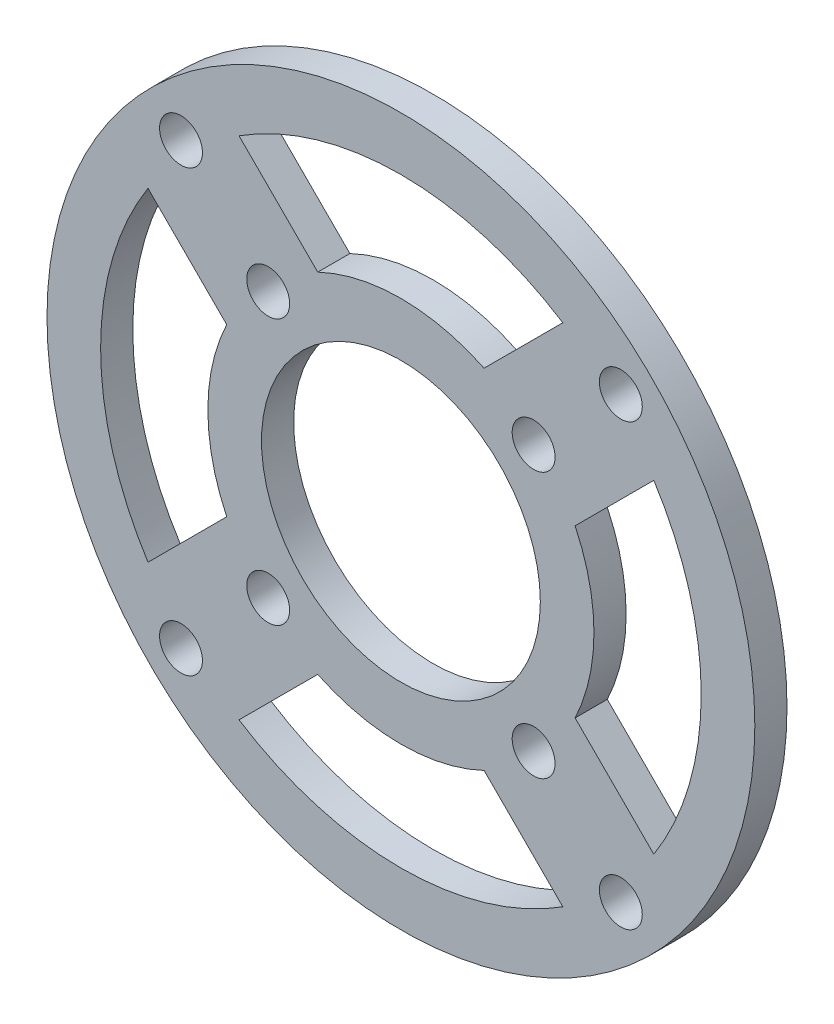
ISO-10303-21;
HEADER;
FILE_DESCRIPTION(('STEP AP214'),'2;1');
FILE_NAME('part.step','',(''),(''),'','','');
FILE_SCHEMA(('AUTOMOTIVE_DESIGN { 1 0 10303 214 1 1 1 1 }'));
ENDSEC;
DATA;
#1=APPLICATION_CONTEXT('core data for automotive mechanical design processes');
#2=APPLICATION_PROTOCOL_DEFINITION('international standard','automotive_design',2000,#1);
#3=PRODUCT_CONTEXT('',#1,'mechanical');
#4=PRODUCT('Part','Part','',(#3));
#5=PRODUCT_RELATED_PRODUCT_CATEGORY('part','',(#4));
#6=PRODUCT_DEFINITION_FORMATION('','',#4);
#7=PRODUCT_DEFINITION_CONTEXT('part definition',#1,'design');
#8=PRODUCT_DEFINITION('design','',#6,#7);
#9=PRODUCT_DEFINITION_SHAPE('','',#8);
#10=(LENGTH_UNIT() NAMED_UNIT(*) SI_UNIT(.MILLI.,.METRE.));
#11=(NAMED_UNIT(*) PLANE_ANGLE_UNIT() SI_UNIT($,.RADIAN.));
#12=(NAMED_UNIT(*) SI_UNIT($,.STERADIAN.) SOLID_ANGLE_UNIT());
#13=UNCERTAINTY_MEASURE_WITH_UNIT(LENGTH_MEASURE(1.E-05),#10,'distance_accuracy_value','');
#14=(GEOMETRIC_REPRESENTATION_CONTEXT(3) GLOBAL_UNCERTAINTY_ASSIGNED_CONTEXT((#13)) GLOBAL_UNIT_ASSIGNED_CONTEXT((#10,
#11,#12)) REPRESENTATION_CONTEXT('',''));
#15=CARTESIAN_POINT('',(0.,0.,0.));
#16=DIRECTION('',(0.,0.,1.));
#17=DIRECTION('',(1.,0.,0.));
#18=AXIS2_PLACEMENT_3D('',#15,#16,#17);
#19=CARTESIAN_POINT('',(0.,0.,3.));
#20=DIRECTION('',(0.,0.,1.));
#21=DIRECTION('',(1.,0.,0.));
#22=AXIS2_PLACEMENT_3D('',#19,#20,#21);
#23=PLANE('',#22);
#24=CARTESIAN_POINT('',(0.,0.,3.));
#25=DIRECTION('',(0.,0.,-1.));
#26=DIRECTION('',(1.,0.,0.));
#27=AXIS2_PLACEMENT_3D('',#24,#25,#26);
#28=CIRCLE('',#27,18.);
#29=CARTESIAN_POINT('',(-7.75735931288063,16.2426406871193,3.));
#30=VERTEX_POINT('',#29);
#31=CARTESIAN_POINT('',(7.75735931288063,16.2426406871193,3.));
#32=VERTEX_POINT('',#31);
#33=EDGE_CURVE('E48',#30,#32,#28,.T.);
#34=ORIENTED_EDGE('',*,*,#33,.F.);
#35=DIRECTION('',(0.707106781186544,-0.707106781186551,0.));
#36=VECTOR('',#35,1.);
#37=CARTESIAN_POINT('',(-7.75735931288063,16.2426406871193,3.));
#38=LINE('',#37,#36);
#39=CARTESIAN_POINT('',(-15.0964389186943,23.5817202929331,3.));
#40=VERTEX_POINT('',#39);
#41=EDGE_CURVE('E167',#40,#30,#38,.T.);
#42=ORIENTED_EDGE('',*,*,#41,.F.);
#43=CARTESIAN_POINT('',(0.,0.,3.));
#44=DIRECTION('',(0.,0.,1.));
#45=DIRECTION('',(1.,0.,0.));
#46=AXIS2_PLACEMENT_3D('',#43,#44,#45);
#47=CIRCLE('',#46,28.);
#48=CARTESIAN_POINT('',(15.0964389186944,23.581720292933,3.));
#49=VERTEX_POINT('',#48);
#50=EDGE_CURVE('E170',#49,#40,#47,.T.);
#51=ORIENTED_EDGE('',*,*,#50,.F.);
#52=DIRECTION('',(0.707106781186551,0.707106781186544,0.));
#53=VECTOR('',#52,1.);
#54=CARTESIAN_POINT('',(7.75735931288063,16.2426406871193,3.));
#55=LINE('',#54,#53);
#56=EDGE_CURVE('E176',#32,#49,#55,.T.);
#57=ORIENTED_EDGE('',*,*,#56,.F.);
#58=EDGE_LOOP('',(#34,#42,#51,#57));
#59=FACE_BOUND('',#58,.T.);
#60=CARTESIAN_POINT('',(0.,0.,3.));
#61=DIRECTION('',(0.,0.,-1.));
#62=DIRECTION('',(1.,0.,0.));
#63=AXIS2_PLACEMENT_3D('',#60,#61,#62);
#64=CIRCLE('',#63,18.);
#65=CARTESIAN_POINT('',(16.2426406871194,7.75735931288057,3.));
#66=VERTEX_POINT('',#65);
#67=CARTESIAN_POINT('',(16.2426406871193,-7.75735931288069,3.));
#68=VERTEX_POINT('',#67);
#69=EDGE_CURVE('E56',#66,#68,#64,.T.);
#70=ORIENTED_EDGE('',*,*,#69,.F.);
#71=DIRECTION('',(-0.707106781186554,-0.707106781186541,0.));
#72=VECTOR('',#71,1.);
#73=CARTESIAN_POINT('',(16.2426406871194,7.75735931288057,3.));
#74=LINE('',#73,#72);
#75=CARTESIAN_POINT('',(23.5817202929331,15.0964389186942,3.));
#76=VERTEX_POINT('',#75);
#77=EDGE_CURVE('E191',#76,#66,#74,.T.);
#78=ORIENTED_EDGE('',*,*,#77,.F.);
#79=CARTESIAN_POINT('',(0.,0.,3.));
#80=DIRECTION('',(0.,0.,1.));
#81=DIRECTION('',(1.,0.,0.));
#82=AXIS2_PLACEMENT_3D('',#79,#80,#81);
#83=CIRCLE('',#82,28.);
#84=CARTESIAN_POINT('',(23.581720292933,-15.0964389186945,3.));
#85=VERTEX_POINT('',#84);
#86=EDGE_CURVE('E206',#85,#76,#83,.T.);
#87=ORIENTED_EDGE('',*,*,#86,.F.);
#88=DIRECTION('',(0.707106781186542,-0.707106781186553,0.));
#89=VECTOR('',#88,1.);
#90=CARTESIAN_POINT('',(16.2426406871193,-7.75735931288069,3.));
#91=LINE('',#90,#89);
#92=EDGE_CURVE('E202',#68,#85,#91,.T.);
#93=ORIENTED_EDGE('',*,*,#92,.F.);
#94=EDGE_LOOP('',(#70,#78,#87,#93));
#95=FACE_BOUND('',#94,.T.);
#96=CARTESIAN_POINT('',(0.,0.,3.));
#97=DIRECTION('',(0.,0.,-1.));
#98=DIRECTION('',(1.,0.,0.));
#99=AXIS2_PLACEMENT_3D('',#96,#97,#98);
#100=CIRCLE('',#99,18.);
#101=CARTESIAN_POINT('',(7.75735931288052,-16.2426406871194,3.));
#102=VERTEX_POINT('',#101);
#103=CARTESIAN_POINT('',(-7.75735931288074,-16.2426406871193,3.));
#104=VERTEX_POINT('',#103);
#105=EDGE_CURVE('E231',#102,#104,#100,.T.);
#106=ORIENTED_EDGE('',*,*,#105,.F.);
#107=DIRECTION('',(-0.707106781186539,0.707106781186556,0.));
#108=VECTOR('',#107,1.);
#109=CARTESIAN_POINT('',(7.75735931288052,-16.2426406871194,3.));
#110=LINE('',#109,#108);
#111=CARTESIAN_POINT('',(15.0964389186941,-23.5817202929332,3.));
#112=VERTEX_POINT('',#111);
#113=EDGE_CURVE('E221',#112,#102,#110,.T.);
#114=ORIENTED_EDGE('',*,*,#113,.F.);
#115=CARTESIAN_POINT('',(0.,0.,3.));
#116=DIRECTION('',(0.,0.,1.));
#117=DIRECTION('',(1.,0.,0.));
#118=AXIS2_PLACEMENT_3D('',#115,#116,#117);
#119=CIRCLE('',#118,28.);
#120=CARTESIAN_POINT('',(-15.0964389186946,-23.5817202929329,3.));
#121=VERTEX_POINT('',#120);
#122=EDGE_CURVE('E237',#121,#112,#119,.T.);
#123=ORIENTED_EDGE('',*,*,#122,.F.);
#124=DIRECTION('',(-0.707106781186556,-0.707106781186539,0.));
#125=VECTOR('',#124,1.);
#126=CARTESIAN_POINT('',(-7.75735931288074,-16.2426406871193,3.));
#127=LINE('',#126,#125);
#128=EDGE_CURVE('E233',#104,#121,#127,.T.);
#129=ORIENTED_EDGE('',*,*,#128,.F.);
#130=EDGE_LOOP('',(#106,#114,#123,#129));
#131=FACE_BOUND('',#130,.T.);
#132=CARTESIAN_POINT('',(0.,0.,3.));
#133=DIRECTION('',(0.,0.,-1.));
#134=DIRECTION('',(1.,0.,0.));
#135=AXIS2_PLACEMENT_3D('',#132,#133,#134);
#136=CIRCLE('',#135,18.);
#137=CARTESIAN_POINT('',(-16.2426406871194,-7.75735931288046,3.));
#138=VERTEX_POINT('',#137);
#139=CARTESIAN_POINT('',(-16.2426406871192,7.7573593128808,3.));
#140=VERTEX_POINT('',#139);
#141=EDGE_CURVE('E263',#138,#140,#136,.T.);
#142=ORIENTED_EDGE('',*,*,#141,.F.);
#143=DIRECTION('',(0.707106781186559,0.707106781186536,0.));
#144=VECTOR('',#143,1.);
#145=CARTESIAN_POINT('',(-16.2426406871194,-7.75735931288046,3.));
#146=LINE('',#145,#144);
#147=CARTESIAN_POINT('',(-23.5817202929332,-15.0964389186941,3.));
#148=VERTEX_POINT('',#147);
#149=EDGE_CURVE('E253',#148,#138,#146,.T.);
#150=ORIENTED_EDGE('',*,*,#149,.F.);
#151=CARTESIAN_POINT('',(0.,0.,3.));
#152=DIRECTION('',(0.,0.,1.));
#153=DIRECTION('',(1.,0.,0.));
#154=AXIS2_PLACEMENT_3D('',#151,#152,#153);
#155=CIRCLE('',#154,28.);
#156=CARTESIAN_POINT('',(-23.5817202929329,15.0964389186946,3.));
#157=VERTEX_POINT('',#156);
#158=EDGE_CURVE('E268',#157,#148,#155,.T.);
#159=ORIENTED_EDGE('',*,*,#158,.F.);
#160=DIRECTION('',(-0.707106781186536,0.707106781186559,0.));
#161=VECTOR('',#160,1.);
#162=CARTESIAN_POINT('',(-16.2426406871192,7.7573593128808,3.));
#163=LINE('',#162,#161);
#164=EDGE_CURVE('E265',#140,#157,#163,.T.);
#165=ORIENTED_EDGE('',*,*,#164,.F.);
#166=EDGE_LOOP('',(#142,#150,#159,#165));
#167=FACE_BOUND('',#166,.T.);
#168=CARTESIAN_POINT('',(12.3743686707645,-12.3743686707646,3.));
#169=DIRECTION('',(0.,0.,1.));
#170=DIRECTION('',(1.,0.,0.));
#171=AXIS2_PLACEMENT_3D('',#168,#169,#170);
#172=CIRCLE('',#171,2.);
#173=CARTESIAN_POINT('',(14.3743686707645,-12.3743686707646,3.));
#174=VERTEX_POINT('',#173);
#175=EDGE_CURVE('E286',#174,#174,#172,.T.);
#176=ORIENTED_EDGE('',*,*,#175,.F.);
#177=EDGE_LOOP('',(#176));
#178=FACE_BOUND('',#177,.T.);
#179=CARTESIAN_POINT('',(0.,0.,3.));
#180=DIRECTION('',(0.,0.,1.));
#181=DIRECTION('',(1.,0.,0.));
#182=AXIS2_PLACEMENT_3D('',#179,#180,#181);
#183=CIRCLE('',#182,13.);
#184=CARTESIAN_POINT('',(13.,0.,3.));
#185=VERTEX_POINT('',#184);
#186=EDGE_CURVE('E298',#185,#185,#183,.T.);
#187=ORIENTED_EDGE('',*,*,#186,.F.);
#188=EDGE_LOOP('',(#187));
#189=FACE_BOUND('',#188,.T.);
#190=CARTESIAN_POINT('',(20.5060966544098,-20.50609665441,3.));
#191=DIRECTION('',(0.,0.,1.));
#192=DIRECTION('',(1.,0.,0.));
#193=AXIS2_PLACEMENT_3D('',#190,#191,#192);
#194=CIRCLE('',#193,2.);
#195=CARTESIAN_POINT('',(22.5060966544098,-20.50609665441,3.));
#196=VERTEX_POINT('',#195);
#197=EDGE_CURVE('E310',#196,#196,#194,.T.);
#198=ORIENTED_EDGE('',*,*,#197,.F.);
#199=EDGE_LOOP('',(#198));
#200=FACE_BOUND('',#199,.T.);
#201=CARTESIAN_POINT('',(-12.3743686707645,12.3743686707646,3.));
#202=DIRECTION('',(0.,0.,1.));
#203=DIRECTION('',(1.,0.,0.));
#204=AXIS2_PLACEMENT_3D('',#201,#202,#203);
#205=CIRCLE('',#204,2.);
#206=CARTESIAN_POINT('',(-10.3743686707645,12.3743686707646,3.));
#207=VERTEX_POINT('',#206);
#208=EDGE_CURVE('E322',#207,#207,#205,.T.);
#209=ORIENTED_EDGE('',*,*,#208,.F.);
#210=EDGE_LOOP('',(#209));
#211=FACE_BOUND('',#210,.T.);
#212=CARTESIAN_POINT('',(0.,0.,3.));
#213=DIRECTION('',(0.,0.,1.));
#214=DIRECTION('',(1.,0.,0.));
#215=AXIS2_PLACEMENT_3D('',#212,#213,#214);
#216=CIRCLE('',#215,33.);
#217=CARTESIAN_POINT('',(33.,0.,3.));
#218=VERTEX_POINT('',#217);
#219=EDGE_CURVE('E11',#218,#218,#216,.T.);
#220=ORIENTED_EDGE('',*,*,#219,.T.);
#221=EDGE_LOOP('',(#220));
#222=FACE_BOUND('',#221,.T.);
#223=CARTESIAN_POINT('',(-20.5060966544098,20.50609665441,3.));
#224=DIRECTION('',(0.,0.,1.));
#225=DIRECTION('',(1.,0.,0.));
#226=AXIS2_PLACEMENT_3D('',#223,#224,#225);
#227=CIRCLE('',#226,2.);
#228=CARTESIAN_POINT('',(-18.5060966544098,20.50609665441,3.));
#229=VERTEX_POINT('',#228);
#230=EDGE_CURVE('E328',#229,#229,#227,.T.);
#231=ORIENTED_EDGE('',*,*,#230,.F.);
#232=EDGE_LOOP('',(#231));
#233=FACE_BOUND('',#232,.T.);
#234=CARTESIAN_POINT('',(20.50609665441,20.5060966544098,3.));
#235=DIRECTION('',(0.,0.,1.));
#236=DIRECTION('',(1.,0.,0.));
#237=AXIS2_PLACEMENT_3D('',#234,#235,#236);
#238=CIRCLE('',#237,2.);
#239=CARTESIAN_POINT('',(22.50609665441,20.5060966544098,3.));
#240=VERTEX_POINT('',#239);
#241=EDGE_CURVE('E316',#240,#240,#238,.T.);
#242=ORIENTED_EDGE('',*,*,#241,.F.);
#243=EDGE_LOOP('',(#242));
#244=FACE_BOUND('',#243,.T.);
#245=CARTESIAN_POINT('',(-20.50609665441,-20.5060966544098,3.));
#246=DIRECTION('',(0.,0.,1.));
#247=DIRECTION('',(1.,0.,0.));
#248=AXIS2_PLACEMENT_3D('',#245,#246,#247);
#249=CIRCLE('',#248,2.00000000000001);
#250=CARTESIAN_POINT('',(-18.50609665441,-20.5060966544098,3.));
#251=VERTEX_POINT('',#250);
#252=EDGE_CURVE('E304',#251,#251,#249,.T.);
#253=ORIENTED_EDGE('',*,*,#252,.F.);
#254=EDGE_LOOP('',(#253));
#255=FACE_BOUND('',#254,.T.);
#256=CARTESIAN_POINT('',(12.3743686707646,12.3743686707645,3.));
#257=DIRECTION('',(0.,0.,1.));
#258=DIRECTION('',(1.,0.,0.));
#259=AXIS2_PLACEMENT_3D('',#256,#257,#258);
#260=CIRCLE('',#259,2.);
#261=CARTESIAN_POINT('',(14.3743686707646,12.3743686707645,3.));
#262=VERTEX_POINT('',#261);
#263=EDGE_CURVE('E292',#262,#262,#260,.T.);
#264=ORIENTED_EDGE('',*,*,#263,.F.);
#265=EDGE_LOOP('',(#264));
#266=FACE_BOUND('',#265,.T.);
#267=CARTESIAN_POINT('',(-12.3743686707646,-12.3743686707645,3.));
#268=DIRECTION('',(0.,0.,1.));
#269=DIRECTION('',(1.,0.,0.));
#270=AXIS2_PLACEMENT_3D('',#267,#268,#269);
#271=CIRCLE('',#270,2.);
#272=CARTESIAN_POINT('',(-10.3743686707646,-12.3743686707645,3.));
#273=VERTEX_POINT('',#272);
#274=EDGE_CURVE('E280',#273,#273,#271,.T.);
#275=ORIENTED_EDGE('',*,*,#274,.F.);
#276=EDGE_LOOP('',(#275));
#277=FACE_BOUND('',#276,.T.);
#278=ADVANCED_FACE('F33',(#59,#95,#131,#167,#178,#189,#200,#211,#222,#233,#244,#255,#266,#277),
#23,.T.);
#279=CARTESIAN_POINT('',(0.,0.,0.));
#280=DIRECTION('',(0.,0.,1.));
#281=DIRECTION('',(1.,0.,0.));
#282=AXIS2_PLACEMENT_3D('',#279,#280,#281);
#283=PLANE('',#282);
#284=DIRECTION('',(0.707106781186544,-0.707106781186551,0.));
#285=VECTOR('',#284,1.);
#286=CARTESIAN_POINT('',(-7.75735931288063,16.2426406871193,0.));
#287=LINE('',#286,#285);
#288=CARTESIAN_POINT('',(-15.0964389186943,23.5817202929331,0.));
#289=VERTEX_POINT('',#288);
#290=CARTESIAN_POINT('',(-7.75735931288063,16.2426406871193,0.));
#291=VERTEX_POINT('',#290);
#292=EDGE_CURVE('E154',#289,#291,#287,.T.);
#293=ORIENTED_EDGE('',*,*,#292,.T.);
#294=CARTESIAN_POINT('',(0.,0.,0.));
#295=DIRECTION('',(0.,0.,-1.));
#296=DIRECTION('',(1.,0.,0.));
#297=AXIS2_PLACEMENT_3D('',#294,#295,#296);
#298=CIRCLE('',#297,18.);
#299=CARTESIAN_POINT('',(7.75735931288063,16.2426406871193,0.));
#300=VERTEX_POINT('',#299);
#301=EDGE_CURVE('E148',#291,#300,#298,.T.);
#302=ORIENTED_EDGE('',*,*,#301,.T.);
#303=DIRECTION('',(0.707106781186551,0.707106781186544,0.));
#304=VECTOR('',#303,1.);
#305=CARTESIAN_POINT('',(7.75735931288063,16.2426406871193,0.));
#306=LINE('',#305,#304);
#307=CARTESIAN_POINT('',(15.0964389186944,23.581720292933,0.));
#308=VERTEX_POINT('',#307);
#309=EDGE_CURVE('E158',#300,#308,#306,.T.);
#310=ORIENTED_EDGE('',*,*,#309,.T.);
#311=CARTESIAN_POINT('',(0.,0.,0.));
#312=DIRECTION('',(0.,0.,1.));
#313=DIRECTION('',(1.,0.,0.));
#314=AXIS2_PLACEMENT_3D('',#311,#312,#313);
#315=CIRCLE('',#314,28.);
#316=EDGE_CURVE('E162',#308,#289,#315,.T.);
#317=ORIENTED_EDGE('',*,*,#316,.T.);
#318=EDGE_LOOP('',(#293,#302,#310,#317));
#319=FACE_BOUND('',#318,.T.);
#320=DIRECTION('',(-0.707106781186554,-0.707106781186541,0.));
#321=VECTOR('',#320,1.);
#322=CARTESIAN_POINT('',(16.2426406871194,7.75735931288057,0.));
#323=LINE('',#322,#321);
#324=CARTESIAN_POINT('',(23.5817202929331,15.0964389186942,0.));
#325=VERTEX_POINT('',#324);
#326=CARTESIAN_POINT('',(16.2426406871194,7.75735931288057,0.));
#327=VERTEX_POINT('',#326);
#328=EDGE_CURVE('E197',#325,#327,#323,.T.);
#329=ORIENTED_EDGE('',*,*,#328,.T.);
#330=CARTESIAN_POINT('',(0.,0.,0.));
#331=DIRECTION('',(0.,0.,-1.));
#332=DIRECTION('',(1.,0.,0.));
#333=AXIS2_PLACEMENT_3D('',#330,#331,#332);
#334=CIRCLE('',#333,18.);
#335=CARTESIAN_POINT('',(16.2426406871193,-7.75735931288069,0.));
#336=VERTEX_POINT('',#335);
#337=EDGE_CURVE('E187',#327,#336,#334,.T.);
#338=ORIENTED_EDGE('',*,*,#337,.T.);
#339=DIRECTION('',(0.707106781186542,-0.707106781186553,0.));
#340=VECTOR('',#339,1.);
#341=CARTESIAN_POINT('',(16.2426406871193,-7.75735931288069,0.));
#342=LINE('',#341,#340);
#343=CARTESIAN_POINT('',(23.581720292933,-15.0964389186945,0.));
#344=VERTEX_POINT('',#343);
#345=EDGE_CURVE('E190',#336,#344,#342,.T.);
#346=ORIENTED_EDGE('',*,*,#345,.T.);
#347=CARTESIAN_POINT('',(0.,0.,0.));
#348=DIRECTION('',(0.,0.,1.));
#349=DIRECTION('',(1.,0.,0.));
#350=AXIS2_PLACEMENT_3D('',#347,#348,#349);
#351=CIRCLE('',#350,28.);
#352=EDGE_CURVE('E194',#344,#325,#351,.T.);
#353=ORIENTED_EDGE('',*,*,#352,.T.);
#354=EDGE_LOOP('',(#329,#338,#346,#353));
#355=FACE_BOUND('',#354,.T.);
#356=DIRECTION('',(-0.707106781186539,0.707106781186556,0.));
#357=VECTOR('',#356,1.);
#358=CARTESIAN_POINT('',(7.75735931288052,-16.2426406871194,0.));
#359=LINE('',#358,#357);
#360=CARTESIAN_POINT('',(15.0964389186941,-23.5817202929332,0.));
#361=VERTEX_POINT('',#360);
#362=CARTESIAN_POINT('',(7.75735931288052,-16.2426406871194,0.));
#363=VERTEX_POINT('',#362);
#364=EDGE_CURVE('E227',#361,#363,#359,.T.);
#365=ORIENTED_EDGE('',*,*,#364,.T.);
#366=CARTESIAN_POINT('',(0.,0.,0.));
#367=DIRECTION('',(0.,0.,-1.));
#368=DIRECTION('',(1.,0.,0.));
#369=AXIS2_PLACEMENT_3D('',#366,#367,#368);
#370=CIRCLE('',#369,18.);
#371=CARTESIAN_POINT('',(-7.75735931288074,-16.2426406871193,0.));
#372=VERTEX_POINT('',#371);
#373=EDGE_CURVE('E217',#363,#372,#370,.T.);
#374=ORIENTED_EDGE('',*,*,#373,.T.);
#375=DIRECTION('',(-0.707106781186556,-0.707106781186539,0.));
#376=VECTOR('',#375,1.);
#377=CARTESIAN_POINT('',(-7.75735931288074,-16.2426406871193,0.));
#378=LINE('',#377,#376);
#379=CARTESIAN_POINT('',(-15.0964389186946,-23.5817202929329,0.));
#380=VERTEX_POINT('',#379);
#381=EDGE_CURVE('E220',#372,#380,#378,.T.);
#382=ORIENTED_EDGE('',*,*,#381,.T.);
#383=CARTESIAN_POINT('',(0.,0.,0.));
#384=DIRECTION('',(0.,0.,1.));
#385=DIRECTION('',(1.,0.,0.));
#386=AXIS2_PLACEMENT_3D('',#383,#384,#385);
#387=CIRCLE('',#386,28.);
#388=EDGE_CURVE('E224',#380,#361,#387,.T.);
#389=ORIENTED_EDGE('',*,*,#388,.T.);
#390=EDGE_LOOP('',(#365,#374,#382,#389));
#391=FACE_BOUND('',#390,.T.);
#392=DIRECTION('',(0.707106781186559,0.707106781186536,0.));
#393=VECTOR('',#392,1.);
#394=CARTESIAN_POINT('',(-16.2426406871194,-7.75735931288046,0.));
#395=LINE('',#394,#393);
#396=CARTESIAN_POINT('',(-23.5817202929332,-15.0964389186941,0.));
#397=VERTEX_POINT('',#396);
#398=CARTESIAN_POINT('',(-16.2426406871194,-7.75735931288046,0.));
#399=VERTEX_POINT('',#398);
#400=EDGE_CURVE('E259',#397,#399,#395,.T.);
#401=ORIENTED_EDGE('',*,*,#400,.T.);
#402=CARTESIAN_POINT('',(0.,0.,0.));
#403=DIRECTION('',(0.,0.,-1.));
#404=DIRECTION('',(1.,0.,0.));
#405=AXIS2_PLACEMENT_3D('',#402,#403,#404);
#406=CIRCLE('',#405,18.);
#407=CARTESIAN_POINT('',(-16.2426406871192,7.7573593128808,0.));
#408=VERTEX_POINT('',#407);
#409=EDGE_CURVE('E249',#399,#408,#406,.T.);
#410=ORIENTED_EDGE('',*,*,#409,.T.);
#411=DIRECTION('',(-0.707106781186536,0.707106781186559,0.));
#412=VECTOR('',#411,1.);
#413=CARTESIAN_POINT('',(-16.2426406871192,7.7573593128808,0.));
#414=LINE('',#413,#412);
#415=CARTESIAN_POINT('',(-23.5817202929329,15.0964389186946,0.));
#416=VERTEX_POINT('',#415);
#417=EDGE_CURVE('E252',#408,#416,#414,.T.);
#418=ORIENTED_EDGE('',*,*,#417,.T.);
#419=CARTESIAN_POINT('',(0.,0.,0.));
#420=DIRECTION('',(0.,0.,1.));
#421=DIRECTION('',(1.,0.,0.));
#422=AXIS2_PLACEMENT_3D('',#419,#420,#421);
#423=CIRCLE('',#422,28.);
#424=EDGE_CURVE('E256',#416,#397,#423,.T.);
#425=ORIENTED_EDGE('',*,*,#424,.T.);
#426=EDGE_LOOP('',(#401,#410,#418,#425));
#427=FACE_BOUND('',#426,.T.);
#428=CARTESIAN_POINT('',(0.,0.,0.));
#429=DIRECTION('',(0.,0.,1.));
#430=DIRECTION('',(1.,0.,0.));
#431=AXIS2_PLACEMENT_3D('',#428,#429,#430);
#432=CIRCLE('',#431,33.);
#433=CARTESIAN_POINT('',(33.,0.,0.));
#434=VERTEX_POINT('',#433);
#435=EDGE_CURVE('E37',#434,#434,#432,.T.);
#436=ORIENTED_EDGE('',*,*,#435,.F.);
#437=EDGE_LOOP('',(#436));
#438=FACE_BOUND('',#437,.T.);
#439=CARTESIAN_POINT('',(-20.5060966544098,20.50609665441,0.));
#440=DIRECTION('',(0.,0.,1.));
#441=DIRECTION('',(1.,0.,0.));
#442=AXIS2_PLACEMENT_3D('',#439,#440,#441);
#443=CIRCLE('',#442,2.);
#444=CARTESIAN_POINT('',(-18.5060966544098,20.50609665441,0.));
#445=VERTEX_POINT('',#444);
#446=EDGE_CURVE('E325',#445,#445,#443,.T.);
#447=ORIENTED_EDGE('',*,*,#446,.T.);
#448=EDGE_LOOP('',(#447));
#449=FACE_BOUND('',#448,.T.);
#450=CARTESIAN_POINT('',(-12.3743686707645,12.3743686707646,0.));
#451=DIRECTION('',(0.,0.,1.));
#452=DIRECTION('',(1.,0.,0.));
#453=AXIS2_PLACEMENT_3D('',#450,#451,#452);
#454=CIRCLE('',#453,2.);
#455=CARTESIAN_POINT('',(-10.3743686707645,12.3743686707646,0.));
#456=VERTEX_POINT('',#455);
#457=EDGE_CURVE('E319',#456,#456,#454,.T.);
#458=ORIENTED_EDGE('',*,*,#457,.T.);
#459=EDGE_LOOP('',(#458));
#460=FACE_BOUND('',#459,.T.);
#461=CARTESIAN_POINT('',(20.50609665441,20.5060966544098,0.));
#462=DIRECTION('',(0.,0.,1.));
#463=DIRECTION('',(1.,0.,0.));
#464=AXIS2_PLACEMENT_3D('',#461,#462,#463);
#465=CIRCLE('',#464,2.);
#466=CARTESIAN_POINT('',(22.50609665441,20.5060966544098,0.));
#467=VERTEX_POINT('',#466);
#468=EDGE_CURVE('E313',#467,#467,#465,.T.);
#469=ORIENTED_EDGE('',*,*,#468,.T.);
#470=EDGE_LOOP('',(#469));
#471=FACE_BOUND('',#470,.T.);
#472=CARTESIAN_POINT('',(20.5060966544098,-20.50609665441,0.));
#473=DIRECTION('',(0.,0.,1.));
#474=DIRECTION('',(1.,0.,0.));
#475=AXIS2_PLACEMENT_3D('',#472,#473,#474);
#476=CIRCLE('',#475,2.);
#477=CARTESIAN_POINT('',(22.5060966544098,-20.50609665441,0.));
#478=VERTEX_POINT('',#477);
#479=EDGE_CURVE('E307',#478,#478,#476,.T.);
#480=ORIENTED_EDGE('',*,*,#479,.T.);
#481=EDGE_LOOP('',(#480));
#482=FACE_BOUND('',#481,.T.);
#483=CARTESIAN_POINT('',(-20.50609665441,-20.5060966544098,0.));
#484=DIRECTION('',(0.,0.,1.));
#485=DIRECTION('',(1.,0.,0.));
#486=AXIS2_PLACEMENT_3D('',#483,#484,#485);
#487=CIRCLE('',#486,2.00000000000001);
#488=CARTESIAN_POINT('',(-18.50609665441,-20.5060966544098,0.));
#489=VERTEX_POINT('',#488);
#490=EDGE_CURVE('E301',#489,#489,#487,.T.);
#491=ORIENTED_EDGE('',*,*,#490,.T.);
#492=EDGE_LOOP('',(#491));
#493=FACE_BOUND('',#492,.T.);
#494=CARTESIAN_POINT('',(0.,0.,0.));
#495=DIRECTION('',(0.,0.,1.));
#496=DIRECTION('',(1.,0.,0.));
#497=AXIS2_PLACEMENT_3D('',#494,#495,#496);
#498=CIRCLE('',#497,13.);
#499=CARTESIAN_POINT('',(13.,0.,0.));
#500=VERTEX_POINT('',#499);
#501=EDGE_CURVE('E295',#500,#500,#498,.T.);
#502=ORIENTED_EDGE('',*,*,#501,.T.);
#503=EDGE_LOOP('',(#502));
#504=FACE_BOUND('',#503,.T.);
#505=CARTESIAN_POINT('',(12.3743686707646,12.3743686707645,0.));
#506=DIRECTION('',(0.,0.,1.));
#507=DIRECTION('',(1.,0.,0.));
#508=AXIS2_PLACEMENT_3D('',#505,#506,#507);
#509=CIRCLE('',#508,2.);
#510=CARTESIAN_POINT('',(14.3743686707646,12.3743686707645,0.));
#511=VERTEX_POINT('',#510);
#512=EDGE_CURVE('E289',#511,#511,#509,.T.);
#513=ORIENTED_EDGE('',*,*,#512,.T.);
#514=EDGE_LOOP('',(#513));
#515=FACE_BOUND('',#514,.T.);
#516=CARTESIAN_POINT('',(12.3743686707645,-12.3743686707646,0.));
#517=DIRECTION('',(0.,0.,1.));
#518=DIRECTION('',(1.,0.,0.));
#519=AXIS2_PLACEMENT_3D('',#516,#517,#518);
#520=CIRCLE('',#519,2.);
#521=CARTESIAN_POINT('',(14.3743686707645,-12.3743686707646,0.));
#522=VERTEX_POINT('',#521);
#523=EDGE_CURVE('E283',#522,#522,#520,.T.);
#524=ORIENTED_EDGE('',*,*,#523,.T.);
#525=EDGE_LOOP('',(#524));
#526=FACE_BOUND('',#525,.T.);
#527=CARTESIAN_POINT('',(-12.3743686707646,-12.3743686707645,0.));
#528=DIRECTION('',(0.,0.,1.));
#529=DIRECTION('',(1.,0.,0.));
#530=AXIS2_PLACEMENT_3D('',#527,#528,#529);
#531=CIRCLE('',#530,2.);
#532=CARTESIAN_POINT('',(-10.3743686707646,-12.3743686707645,0.));
#533=VERTEX_POINT('',#532);
#534=EDGE_CURVE('E183',#533,#533,#531,.T.);
#535=ORIENTED_EDGE('',*,*,#534,.T.);
#536=EDGE_LOOP('',(#535));
#537=FACE_BOUND('',#536,.T.);
#538=ADVANCED_FACE('F164',(#319,#355,#391,#427,#438,#449,#460,#471,#482,#493,#504,#515,#526,
#537),#283,.F.);
#539=CARTESIAN_POINT('',(0.,0.,3.));
#540=DIRECTION('',(0.,0.,-1.));
#541=DIRECTION('',(-1.,0.,0.));
#542=AXIS2_PLACEMENT_3D('',#539,#540,#541);
#543=CYLINDRICAL_SURFACE('',#542,33.);
#544=ORIENTED_EDGE('',*,*,#219,.F.);
#545=EDGE_LOOP('',(#544));
#546=FACE_BOUND('',#545,.T.);
#547=ORIENTED_EDGE('',*,*,#435,.T.);
#548=EDGE_LOOP('',(#547));
#549=FACE_BOUND('',#548,.T.);
#550=ADVANCED_FACE('F35',(#546,#549),#543,.T.);
#551=CARTESIAN_POINT('',(-20.5060966544098,20.50609665441,3.));
#552=DIRECTION('',(0.,0.,-1.));
#553=DIRECTION('',(-1.,0.,0.));
#554=AXIS2_PLACEMENT_3D('',#551,#552,#553);
#555=CYLINDRICAL_SURFACE('',#554,2.);
#556=ORIENTED_EDGE('',*,*,#230,.T.);
#557=EDGE_LOOP('',(#556));
#558=FACE_BOUND('',#557,.T.);
#559=ORIENTED_EDGE('',*,*,#446,.F.);
#560=EDGE_LOOP('',(#559));
#561=FACE_BOUND('',#560,.T.);
#562=ADVANCED_FACE('F336',(#558,#561),#555,.F.);
#563=CARTESIAN_POINT('',(-12.3743686707645,12.3743686707646,3.));
#564=DIRECTION('',(0.,0.,-1.));
#565=DIRECTION('',(-1.,0.,0.));
#566=AXIS2_PLACEMENT_3D('',#563,#564,#565);
#567=CYLINDRICAL_SURFACE('',#566,2.);
#568=ORIENTED_EDGE('',*,*,#208,.T.);
#569=EDGE_LOOP('',(#568));
#570=FACE_BOUND('',#569,.T.);
#571=ORIENTED_EDGE('',*,*,#457,.F.);
#572=EDGE_LOOP('',(#571));
#573=FACE_BOUND('',#572,.T.);
#574=ADVANCED_FACE('F338',(#570,#573),#567,.F.);
#575=CARTESIAN_POINT('',(20.50609665441,20.5060966544098,3.));
#576=DIRECTION('',(0.,0.,-1.));
#577=DIRECTION('',(-1.,0.,0.));
#578=AXIS2_PLACEMENT_3D('',#575,#576,#577);
#579=CYLINDRICAL_SURFACE('',#578,2.);
#580=ORIENTED_EDGE('',*,*,#241,.T.);
#581=EDGE_LOOP('',(#580));
#582=FACE_BOUND('',#581,.T.);
#583=ORIENTED_EDGE('',*,*,#468,.F.);
#584=EDGE_LOOP('',(#583));
#585=FACE_BOUND('',#584,.T.);
#586=ADVANCED_FACE('F345',(#582,#585),#579,.F.);
#587=CARTESIAN_POINT('',(20.5060966544098,-20.50609665441,3.));
#588=DIRECTION('',(0.,0.,-1.));
#589=DIRECTION('',(-1.,0.,0.));
#590=AXIS2_PLACEMENT_3D('',#587,#588,#589);
#591=CYLINDRICAL_SURFACE('',#590,2.);
#592=ORIENTED_EDGE('',*,*,#197,.T.);
#593=EDGE_LOOP('',(#592));
#594=FACE_BOUND('',#593,.T.);
#595=ORIENTED_EDGE('',*,*,#479,.F.);
#596=EDGE_LOOP('',(#595));
#597=FACE_BOUND('',#596,.T.);
#598=ADVANCED_FACE('F418',(#594,#597),#591,.F.);
#599=CARTESIAN_POINT('',(-20.50609665441,-20.5060966544098,3.));
#600=DIRECTION('',(0.,0.,-1.));
#601=DIRECTION('',(-1.,0.,0.));
#602=AXIS2_PLACEMENT_3D('',#599,#600,#601);
#603=CYLINDRICAL_SURFACE('',#602,2.00000000000001);
#604=ORIENTED_EDGE('',*,*,#252,.T.);
#605=EDGE_LOOP('',(#604));
#606=FACE_BOUND('',#605,.T.);
#607=ORIENTED_EDGE('',*,*,#490,.F.);
#608=EDGE_LOOP('',(#607));
#609=FACE_BOUND('',#608,.T.);
#610=ADVANCED_FACE('F414',(#606,#609),#603,.F.);
#611=CARTESIAN_POINT('',(0.,0.,3.));
#612=DIRECTION('',(0.,0.,-1.));
#613=DIRECTION('',(-1.,0.,0.));
#614=AXIS2_PLACEMENT_3D('',#611,#612,#613);
#615=CYLINDRICAL_SURFACE('',#614,13.);
#616=ORIENTED_EDGE('',*,*,#186,.T.);
#617=EDGE_LOOP('',(#616));
#618=FACE_BOUND('',#617,.T.);
#619=ORIENTED_EDGE('',*,*,#501,.F.);
#620=EDGE_LOOP('',(#619));
#621=FACE_BOUND('',#620,.T.);
#622=ADVANCED_FACE('F410',(#618,#621),#615,.F.);
#623=CARTESIAN_POINT('',(12.3743686707646,12.3743686707645,3.));
#624=DIRECTION('',(0.,0.,-1.));
#625=DIRECTION('',(-1.,0.,0.));
#626=AXIS2_PLACEMENT_3D('',#623,#624,#625);
#627=CYLINDRICAL_SURFACE('',#626,2.);
#628=ORIENTED_EDGE('',*,*,#263,.T.);
#629=EDGE_LOOP('',(#628));
#630=FACE_BOUND('',#629,.T.);
#631=ORIENTED_EDGE('',*,*,#512,.F.);
#632=EDGE_LOOP('',(#631));
#633=FACE_BOUND('',#632,.T.);
#634=ADVANCED_FACE('F403',(#630,#633),#627,.F.);
#635=CARTESIAN_POINT('',(12.3743686707645,-12.3743686707646,3.));
#636=DIRECTION('',(0.,0.,-1.));
#637=DIRECTION('',(-1.,0.,0.));
#638=AXIS2_PLACEMENT_3D('',#635,#636,#637);
#639=CYLINDRICAL_SURFACE('',#638,2.);
#640=ORIENTED_EDGE('',*,*,#175,.T.);
#641=EDGE_LOOP('',(#640));
#642=FACE_BOUND('',#641,.T.);
#643=ORIENTED_EDGE('',*,*,#523,.F.);
#644=EDGE_LOOP('',(#643));
#645=FACE_BOUND('',#644,.T.);
#646=ADVANCED_FACE('F392',(#642,#645),#639,.F.);
#647=CARTESIAN_POINT('',(-12.3743686707646,-12.3743686707645,3.));
#648=DIRECTION('',(0.,0.,-1.));
#649=DIRECTION('',(-1.,0.,0.));
#650=AXIS2_PLACEMENT_3D('',#647,#648,#649);
#651=CYLINDRICAL_SURFACE('',#650,2.);
#652=ORIENTED_EDGE('',*,*,#274,.T.);
#653=EDGE_LOOP('',(#652));
#654=FACE_BOUND('',#653,.T.);
#655=ORIENTED_EDGE('',*,*,#534,.F.);
#656=EDGE_LOOP('',(#655));
#657=FACE_BOUND('',#656,.T.);
#658=ADVANCED_FACE('F388',(#654,#657),#651,.F.);
#659=CARTESIAN_POINT('',(0.,0.,0.));
#660=DIRECTION('',(0.,0.,1.));
#661=DIRECTION('',(1.,0.,0.));
#662=AXIS2_PLACEMENT_3D('',#659,#660,#661);
#663=CYLINDRICAL_SURFACE('',#662,18.);
#664=ORIENTED_EDGE('',*,*,#141,.T.);
#665=DIRECTION('',(0.,0.,1.));
#666=VECTOR('',#665,1.);
#667=CARTESIAN_POINT('',(-16.2426406871192,7.7573593128808,0.));
#668=LINE('',#667,#666);
#669=EDGE_CURVE('E262',#408,#140,#668,.T.);
#670=ORIENTED_EDGE('',*,*,#669,.F.);
#671=ORIENTED_EDGE('',*,*,#409,.F.);
#672=DIRECTION('',(0.,0.,1.));
#673=VECTOR('',#672,1.);
#674=CARTESIAN_POINT('',(-16.2426406871194,-7.75735931288046,0.));
#675=LINE('',#674,#673);
#676=EDGE_CURVE('E234',#399,#138,#675,.T.);
#677=ORIENTED_EDGE('',*,*,#676,.T.);
#678=EDGE_LOOP('',(#664,#670,#671,#677));
#679=FACE_BOUND('',#678,.T.);
#680=ADVANCED_FACE('F391',(#679),#663,.T.);
#681=CARTESIAN_POINT('',(-16.2426406871194,-7.75735931288046,0.));
#682=DIRECTION('',(0.707106781186536,-0.707106781186559,0.));
#683=DIRECTION('',(0.707106781186559,0.707106781186536,0.));
#684=AXIS2_PLACEMENT_3D('',#681,#682,#683);
#685=PLANE('',#684);
#686=ORIENTED_EDGE('',*,*,#149,.T.);
#687=ORIENTED_EDGE('',*,*,#676,.F.);
#688=ORIENTED_EDGE('',*,*,#400,.F.);
#689=DIRECTION('',(0.,0.,1.));
#690=VECTOR('',#689,1.);
#691=CARTESIAN_POINT('',(-23.5817202929332,-15.0964389186941,0.));
#692=LINE('',#691,#690);
#693=EDGE_CURVE('E274',#397,#148,#692,.T.);
#694=ORIENTED_EDGE('',*,*,#693,.T.);
#695=EDGE_LOOP('',(#686,#687,#688,#694));
#696=FACE_BOUND('',#695,.T.);
#697=ADVANCED_FACE('F400',(#696),#685,.F.);
#698=CARTESIAN_POINT('',(0.,0.,0.));
#699=DIRECTION('',(0.,0.,1.));
#700=DIRECTION('',(1.,0.,0.));
#701=AXIS2_PLACEMENT_3D('',#698,#699,#700);
#702=CYLINDRICAL_SURFACE('',#701,28.);
#703=ORIENTED_EDGE('',*,*,#158,.T.);
#704=ORIENTED_EDGE('',*,*,#693,.F.);
#705=ORIENTED_EDGE('',*,*,#424,.F.);
#706=DIRECTION('',(0.,0.,1.));
#707=VECTOR('',#706,1.);
#708=CARTESIAN_POINT('',(-23.5817202929329,15.0964389186946,0.));
#709=LINE('',#708,#707);
#710=EDGE_CURVE('E276',#416,#157,#709,.T.);
#711=ORIENTED_EDGE('',*,*,#710,.T.);
#712=EDGE_LOOP('',(#703,#704,#705,#711));
#713=FACE_BOUND('',#712,.T.);
#714=ADVANCED_FACE('F497',(#713),#702,.F.);
#715=CARTESIAN_POINT('',(-16.2426406871192,7.7573593128808,0.));
#716=DIRECTION('',(0.707106781186559,0.707106781186536,0.));
#717=DIRECTION('',(-0.707106781186536,0.707106781186559,0.));
#718=AXIS2_PLACEMENT_3D('',#715,#716,#717);
#719=PLANE('',#718);
#720=ORIENTED_EDGE('',*,*,#164,.T.);
#721=ORIENTED_EDGE('',*,*,#710,.F.);
#722=ORIENTED_EDGE('',*,*,#417,.F.);
#723=ORIENTED_EDGE('',*,*,#669,.T.);
#724=EDGE_LOOP('',(#720,#721,#722,#723));
#725=FACE_BOUND('',#724,.T.);
#726=ADVANCED_FACE('F507',(#725),#719,.F.);
#727=CARTESIAN_POINT('',(0.,0.,0.));
#728=DIRECTION('',(0.,0.,1.));
#729=DIRECTION('',(1.,0.,0.));
#730=AXIS2_PLACEMENT_3D('',#727,#728,#729);
#731=CYLINDRICAL_SURFACE('',#730,18.);
#732=ORIENTED_EDGE('',*,*,#105,.T.);
#733=DIRECTION('',(0.,0.,1.));
#734=VECTOR('',#733,1.);
#735=CARTESIAN_POINT('',(-7.75735931288074,-16.2426406871193,0.));
#736=LINE('',#735,#734);
#737=EDGE_CURVE('E230',#372,#104,#736,.T.);
#738=ORIENTED_EDGE('',*,*,#737,.F.);
#739=ORIENTED_EDGE('',*,*,#373,.F.);
#740=DIRECTION('',(0.,0.,1.));
#741=VECTOR('',#740,1.);
#742=CARTESIAN_POINT('',(7.75735931288052,-16.2426406871194,0.));
#743=LINE('',#742,#741);
#744=EDGE_CURVE('E203',#363,#102,#743,.T.);
#745=ORIENTED_EDGE('',*,*,#744,.T.);
#746=EDGE_LOOP('',(#732,#738,#739,#745));
#747=FACE_BOUND('',#746,.T.);
#748=ADVANCED_FACE('F517',(#747),#731,.T.);
#749=CARTESIAN_POINT('',(7.75735931288052,-16.2426406871194,0.));
#750=DIRECTION('',(0.707106781186556,0.707106781186539,0.));
#751=DIRECTION('',(-0.707106781186539,0.707106781186556,0.));
#752=AXIS2_PLACEMENT_3D('',#749,#750,#751);
#753=PLANE('',#752);
#754=ORIENTED_EDGE('',*,*,#113,.T.);
#755=ORIENTED_EDGE('',*,*,#744,.F.);
#756=ORIENTED_EDGE('',*,*,#364,.F.);
#757=DIRECTION('',(0.,0.,1.));
#758=VECTOR('',#757,1.);
#759=CARTESIAN_POINT('',(15.0964389186941,-23.5817202929332,0.));
#760=LINE('',#759,#758);
#761=EDGE_CURVE('E243',#361,#112,#760,.T.);
#762=ORIENTED_EDGE('',*,*,#761,.T.);
#763=EDGE_LOOP('',(#754,#755,#756,#762));
#764=FACE_BOUND('',#763,.T.);
#765=ADVANCED_FACE('F526',(#764),#753,.F.);
#766=CARTESIAN_POINT('',(0.,0.,0.));
#767=DIRECTION('',(0.,0.,1.));
#768=DIRECTION('',(1.,0.,0.));
#769=AXIS2_PLACEMENT_3D('',#766,#767,#768);
#770=CYLINDRICAL_SURFACE('',#769,28.);
#771=ORIENTED_EDGE('',*,*,#122,.T.);
#772=ORIENTED_EDGE('',*,*,#761,.F.);
#773=ORIENTED_EDGE('',*,*,#388,.F.);
#774=DIRECTION('',(0.,0.,1.));
#775=VECTOR('',#774,1.);
#776=CARTESIAN_POINT('',(-15.0964389186946,-23.5817202929329,0.));
#777=LINE('',#776,#775);
#778=EDGE_CURVE('E245',#380,#121,#777,.T.);
#779=ORIENTED_EDGE('',*,*,#778,.T.);
#780=EDGE_LOOP('',(#771,#772,#773,#779));
#781=FACE_BOUND('',#780,.T.);
#782=ADVANCED_FACE('F536',(#781),#770,.F.);
#783=CARTESIAN_POINT('',(-7.75735931288074,-16.2426406871193,0.));
#784=DIRECTION('',(-0.707106781186539,0.707106781186556,0.));
#785=DIRECTION('',(-0.707106781186556,-0.707106781186539,0.));
#786=AXIS2_PLACEMENT_3D('',#783,#784,#785);
#787=PLANE('',#786);
#788=ORIENTED_EDGE('',*,*,#128,.T.);
#789=ORIENTED_EDGE('',*,*,#778,.F.);
#790=ORIENTED_EDGE('',*,*,#381,.F.);
#791=ORIENTED_EDGE('',*,*,#737,.T.);
#792=EDGE_LOOP('',(#788,#789,#790,#791));
#793=FACE_BOUND('',#792,.T.);
#794=ADVANCED_FACE('F546',(#793),#787,.F.);
#795=CARTESIAN_POINT('',(0.,0.,0.));
#796=DIRECTION('',(0.,0.,1.));
#797=DIRECTION('',(1.,0.,0.));
#798=AXIS2_PLACEMENT_3D('',#795,#796,#797);
#799=CYLINDRICAL_SURFACE('',#798,18.);
#800=ORIENTED_EDGE('',*,*,#69,.T.);
#801=DIRECTION('',(0.,0.,1.));
#802=VECTOR('',#801,1.);
#803=CARTESIAN_POINT('',(16.2426406871193,-7.75735931288069,0.));
#804=LINE('',#803,#802);
#805=EDGE_CURVE('E200',#336,#68,#804,.T.);
#806=ORIENTED_EDGE('',*,*,#805,.F.);
#807=ORIENTED_EDGE('',*,*,#337,.F.);
#808=DIRECTION('',(0.,0.,1.));
#809=VECTOR('',#808,1.);
#810=CARTESIAN_POINT('',(16.2426406871194,7.75735931288057,0.));
#811=LINE('',#810,#809);
#812=EDGE_CURVE('E177',#327,#66,#811,.T.);
#813=ORIENTED_EDGE('',*,*,#812,.T.);
#814=EDGE_LOOP('',(#800,#806,#807,#813));
#815=FACE_BOUND('',#814,.T.);
#816=ADVANCED_FACE('F556',(#815),#799,.T.);
#817=CARTESIAN_POINT('',(16.2426406871194,7.75735931288057,0.));
#818=DIRECTION('',(-0.707106781186541,0.707106781186554,0.));
#819=DIRECTION('',(-0.707106781186554,-0.707106781186541,0.));
#820=AXIS2_PLACEMENT_3D('',#817,#818,#819);
#821=PLANE('',#820);
#822=ORIENTED_EDGE('',*,*,#77,.T.);
#823=ORIENTED_EDGE('',*,*,#812,.F.);
#824=ORIENTED_EDGE('',*,*,#328,.F.);
#825=DIRECTION('',(0.,0.,1.));
#826=VECTOR('',#825,1.);
#827=CARTESIAN_POINT('',(23.5817202929331,15.0964389186942,0.));
#828=LINE('',#827,#826);
#829=EDGE_CURVE('E212',#325,#76,#828,.T.);
#830=ORIENTED_EDGE('',*,*,#829,.T.);
#831=EDGE_LOOP('',(#822,#823,#824,#830));
#832=FACE_BOUND('',#831,.T.);
#833=ADVANCED_FACE('F566',(#832),#821,.F.);
#834=CARTESIAN_POINT('',(0.,0.,0.));
#835=DIRECTION('',(0.,0.,1.));
#836=DIRECTION('',(1.,0.,0.));
#837=AXIS2_PLACEMENT_3D('',#834,#835,#836);
#838=CYLINDRICAL_SURFACE('',#837,28.);
#839=ORIENTED_EDGE('',*,*,#86,.T.);
#840=ORIENTED_EDGE('',*,*,#829,.F.);
#841=ORIENTED_EDGE('',*,*,#352,.F.);
#842=DIRECTION('',(0.,0.,1.));
#843=VECTOR('',#842,1.);
#844=CARTESIAN_POINT('',(23.581720292933,-15.0964389186945,0.));
#845=LINE('',#844,#843);
#846=EDGE_CURVE('E214',#344,#85,#845,.T.);
#847=ORIENTED_EDGE('',*,*,#846,.T.);
#848=EDGE_LOOP('',(#839,#840,#841,#847));
#849=FACE_BOUND('',#848,.T.);
#850=ADVANCED_FACE('F575',(#849),#838,.F.);
#851=CARTESIAN_POINT('',(16.2426406871193,-7.75735931288069,0.));
#852=DIRECTION('',(-0.707106781186553,-0.707106781186542,0.));
#853=DIRECTION('',(0.707106781186542,-0.707106781186553,0.));
#854=AXIS2_PLACEMENT_3D('',#851,#852,#853);
#855=PLANE('',#854);
#856=ORIENTED_EDGE('',*,*,#92,.T.);
#857=ORIENTED_EDGE('',*,*,#846,.F.);
#858=ORIENTED_EDGE('',*,*,#345,.F.);
#859=ORIENTED_EDGE('',*,*,#805,.T.);
#860=EDGE_LOOP('',(#856,#857,#858,#859));
#861=FACE_BOUND('',#860,.T.);
#862=ADVANCED_FACE('F585',(#861),#855,.F.);
#863=CARTESIAN_POINT('',(0.,0.,0.));
#864=DIRECTION('',(0.,0.,1.));
#865=DIRECTION('',(1.,0.,0.));
#866=AXIS2_PLACEMENT_3D('',#863,#864,#865);
#867=CYLINDRICAL_SURFACE('',#866,18.);
#868=ORIENTED_EDGE('',*,*,#33,.T.);
#869=DIRECTION('',(0.,0.,1.));
#870=VECTOR('',#869,1.);
#871=CARTESIAN_POINT('',(7.75735931288063,16.2426406871193,0.));
#872=LINE('',#871,#870);
#873=EDGE_CURVE('E144',#300,#32,#872,.T.);
#874=ORIENTED_EDGE('',*,*,#873,.F.);
#875=ORIENTED_EDGE('',*,*,#301,.F.);
#876=DIRECTION('',(0.,0.,1.));
#877=VECTOR('',#876,1.);
#878=CARTESIAN_POINT('',(-7.75735931288063,16.2426406871193,0.));
#879=LINE('',#878,#877);
#880=EDGE_CURVE('E181',#291,#30,#879,.T.);
#881=ORIENTED_EDGE('',*,*,#880,.T.);
#882=EDGE_LOOP('',(#868,#874,#875,#881));
#883=FACE_BOUND('',#882,.T.);
#884=ADVANCED_FACE('F146',(#883),#867,.T.);
#885=CARTESIAN_POINT('',(-7.75735931288063,16.2426406871193,0.));
#886=DIRECTION('',(-0.707106781186551,-0.707106781186544,0.));
#887=DIRECTION('',(0.707106781186544,-0.707106781186551,0.));
#888=AXIS2_PLACEMENT_3D('',#885,#886,#887);
#889=PLANE('',#888);
#890=ORIENTED_EDGE('',*,*,#41,.T.);
#891=ORIENTED_EDGE('',*,*,#880,.F.);
#892=ORIENTED_EDGE('',*,*,#292,.F.);
#893=DIRECTION('',(0.,0.,1.));
#894=VECTOR('',#893,1.);
#895=CARTESIAN_POINT('',(-15.0964389186943,23.5817202929331,0.));
#896=LINE('',#895,#894);
#897=EDGE_CURVE('E184',#289,#40,#896,.T.);
#898=ORIENTED_EDGE('',*,*,#897,.T.);
#899=EDGE_LOOP('',(#890,#891,#892,#898));
#900=FACE_BOUND('',#899,.T.);
#901=ADVANCED_FACE('F604',(#900),#889,.F.);
#902=CARTESIAN_POINT('',(0.,0.,0.));
#903=DIRECTION('',(0.,0.,1.));
#904=DIRECTION('',(1.,0.,0.));
#905=AXIS2_PLACEMENT_3D('',#902,#903,#904);
#906=CYLINDRICAL_SURFACE('',#905,28.);
#907=ORIENTED_EDGE('',*,*,#50,.T.);
#908=ORIENTED_EDGE('',*,*,#897,.F.);
#909=ORIENTED_EDGE('',*,*,#316,.F.);
#910=DIRECTION('',(0.,0.,1.));
#911=VECTOR('',#910,1.);
#912=CARTESIAN_POINT('',(15.0964389186944,23.581720292933,0.));
#913=LINE('',#912,#911);
#914=EDGE_CURVE('E153',#308,#49,#913,.T.);
#915=ORIENTED_EDGE('',*,*,#914,.T.);
#916=EDGE_LOOP('',(#907,#908,#909,#915));
#917=FACE_BOUND('',#916,.T.);
#918=ADVANCED_FACE('F613',(#917),#906,.F.);
#919=CARTESIAN_POINT('',(7.75735931288063,16.2426406871193,0.));
#920=DIRECTION('',(0.707106781186544,-0.707106781186551,0.));
#921=DIRECTION('',(0.707106781186551,0.707106781186544,0.));
#922=AXIS2_PLACEMENT_3D('',#919,#920,#921);
#923=PLANE('',#922);
#924=ORIENTED_EDGE('',*,*,#56,.T.);
#925=ORIENTED_EDGE('',*,*,#914,.F.);
#926=ORIENTED_EDGE('',*,*,#309,.F.);
#927=ORIENTED_EDGE('',*,*,#873,.T.);
#928=EDGE_LOOP('',(#924,#925,#926,#927));
#929=FACE_BOUND('',#928,.T.);
#930=ADVANCED_FACE('F159',(#929),#923,.F.);
#931=CLOSED_SHELL('',(#278,#538,#550,#562,#574,#586,#598,#610,#622,#634,#646,#658,#680,#697,
#714,#726,#748,#765,#782,#794,#816,#833,#850,#862,#884,#901,#918,#930));
#932=MANIFOLD_SOLID_BREP('B2',#931);
#933=ADVANCED_BREP_SHAPE_REPRESENTATION('',(#18,#932),#14);
#934=SHAPE_DEFINITION_REPRESENTATION(#9,#933);
ENDSEC;
END-ISO-10303-21;
